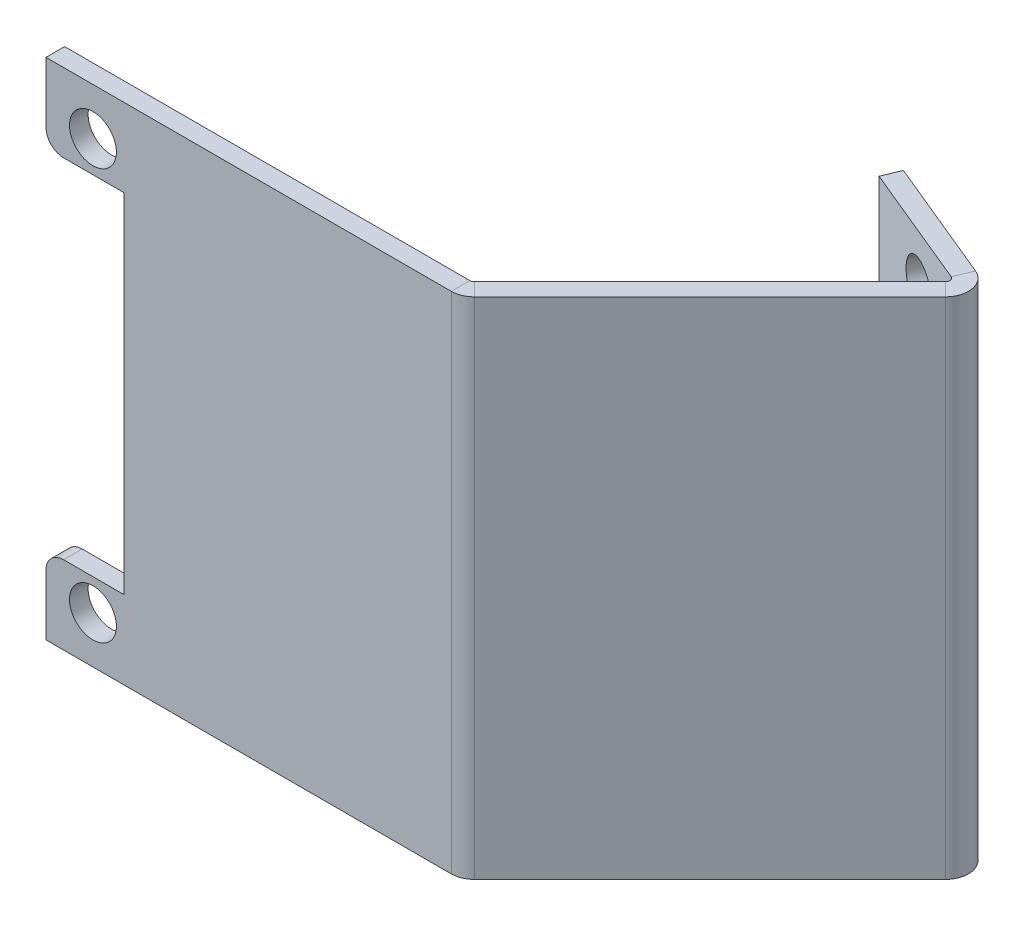
ISO-10303-21;
HEADER;
FILE_DESCRIPTION(('STEP AP214'),'2;1');
FILE_NAME('part.step','',(''),(''),'','','');
FILE_SCHEMA(('AUTOMOTIVE_DESIGN { 1 0 10303 214 1 1 1 1 }'));
ENDSEC;
DATA;
#1=APPLICATION_CONTEXT('core data for automotive mechanical design processes');
#2=APPLICATION_PROTOCOL_DEFINITION('international standard','automotive_design',2000,#1);
#3=PRODUCT_CONTEXT('',#1,'mechanical');
#4=PRODUCT('Part','Part','',(#3));
#5=PRODUCT_RELATED_PRODUCT_CATEGORY('part','',(#4));
#6=PRODUCT_DEFINITION_FORMATION('','',#4);
#7=PRODUCT_DEFINITION_CONTEXT('part definition',#1,'design');
#8=PRODUCT_DEFINITION('design','',#6,#7);
#9=PRODUCT_DEFINITION_SHAPE('','',#8);
#10=(LENGTH_UNIT() NAMED_UNIT(*) SI_UNIT(.MILLI.,.METRE.));
#11=(NAMED_UNIT(*) PLANE_ANGLE_UNIT() SI_UNIT($,.RADIAN.));
#12=(NAMED_UNIT(*) SI_UNIT($,.STERADIAN.) SOLID_ANGLE_UNIT());
#13=UNCERTAINTY_MEASURE_WITH_UNIT(LENGTH_MEASURE(1.E-05),#10,'distance_accuracy_value','');
#14=(GEOMETRIC_REPRESENTATION_CONTEXT(3) GLOBAL_UNCERTAINTY_ASSIGNED_CONTEXT((#13)) GLOBAL_UNIT_ASSIGNED_CONTEXT((#10,
#11,#12)) REPRESENTATION_CONTEXT('',''));
#15=CARTESIAN_POINT('',(0.,0.,0.));
#16=DIRECTION('',(0.,0.,1.));
#17=DIRECTION('',(1.,0.,0.));
#18=AXIS2_PLACEMENT_3D('',#15,#16,#17);
#19=CARTESIAN_POINT('',(-16.3657026940798,0.,-42.9267314711177));
#20=DIRECTION('',(-0.707106781186549,0.,-0.707106781186546));
#21=DIRECTION('',(-0.707106781186546,0.,0.707106781186549));
#22=AXIS2_PLACEMENT_3D('',#19,#20,#21);
#23=PLANE('',#22);
#24=DIRECTION('',(-0.707106781186546,0.,0.707106781186549));
#25=VECTOR('',#24,1.);
#26=CARTESIAN_POINT('',(1.31196683558388,86.,-60.6044010007815));
#27=LINE('',#26,#25);
#28=CARTESIAN_POINT('',(-17.9790939810444,86.,-41.3133401841531));
#29=VERTEX_POINT('',#28);
#30=CARTESIAN_POINT('',(-58.1467530504867,86.0000000000001,-1.1456811147107));
#31=VERTEX_POINT('',#30);
#32=EDGE_CURVE('E291',#29,#31,#27,.T.);
#33=ORIENTED_EDGE('',*,*,#32,.T.);
#34=DIRECTION('',(0.,-1.,0.));
#35=VECTOR('',#34,1.);
#36=CARTESIAN_POINT('',(-58.1467530504867,0.,-1.1456811147107));
#37=LINE('',#36,#35);
#38=CARTESIAN_POINT('',(-58.1467530504867,0.,-1.1456811147107));
#39=VERTEX_POINT('',#38);
#40=EDGE_CURVE('E348',#31,#39,#37,.T.);
#41=ORIENTED_EDGE('',*,*,#40,.T.);
#42=DIRECTION('',(-0.707106781186546,0.,0.707106781186549));
#43=VECTOR('',#42,1.);
#44=CARTESIAN_POINT('',(-16.3657026940798,0.,-42.9267314711177));
#45=LINE('',#44,#43);
#46=CARTESIAN_POINT('',(-17.9790939810444,0.,-41.3133401841531));
#47=VERTEX_POINT('',#46);
#48=EDGE_CURVE('E358',#47,#39,#45,.T.);
#49=ORIENTED_EDGE('',*,*,#48,.F.);
#50=DIRECTION('',(0.,-1.,0.));
#51=VECTOR('',#50,1.);
#52=CARTESIAN_POINT('',(-17.9790939810444,0.,-41.3133401841531));
#53=LINE('',#52,#51);
#54=EDGE_CURVE('E282',#29,#47,#53,.T.);
#55=ORIENTED_EDGE('',*,*,#54,.F.);
#56=EDGE_LOOP('',(#33,#41,#49,#55));
#57=FACE_BOUND('',#56,.T.);
#58=ADVANCED_FACE('F54',(#57),#23,.F.);
#59=CARTESIAN_POINT('',(-18.6107667243471,0.,-45.171795501385));
#60=DIRECTION('',(0.,1.,0.));
#61=DIRECTION('',(-0.707106781186546,0.,0.707106781186549));
#62=AXIS2_PLACEMENT_3D('',#59,#60,#61);
#63=PLANE('',#62);
#64=ORIENTED_EDGE('',*,*,#48,.T.);
#65=DIRECTION('',(-0.707106781186549,0.,-0.707106781186546));
#66=VECTOR('',#65,1.);
#67=CARTESIAN_POINT('',(-60.391817080754,0.,-3.39074514497799));
#68=LINE('',#67,#66);
#69=CARTESIAN_POINT('',(-60.391817080754,0.,-3.39074514497799));
#70=VERTEX_POINT('',#69);
#71=EDGE_CURVE('E346',#39,#70,#68,.T.);
#72=ORIENTED_EDGE('',*,*,#71,.T.);
#73=DIRECTION('',(-0.707106781186546,0.,0.707106781186549));
#74=VECTOR('',#73,1.);
#75=CARTESIAN_POINT('',(-0.933097194683407,0.,-62.8494650310487));
#76=LINE('',#75,#74);
#77=CARTESIAN_POINT('',(-20.2241580113117,0.,-43.5584042144204));
#78=VERTEX_POINT('',#77);
#79=EDGE_CURVE('E295',#78,#70,#76,.T.);
#80=ORIENTED_EDGE('',*,*,#79,.F.);
#81=DIRECTION('',(-0.707106781186549,0.,-0.707106781186546));
#82=VECTOR('',#81,1.);
#83=CARTESIAN_POINT('',(-20.2241580113117,0.,-43.5584042144204));
#84=LINE('',#83,#82);
#85=EDGE_CURVE('E296',#47,#78,#84,.T.);
#86=ORIENTED_EDGE('',*,*,#85,.F.);
#87=EDGE_LOOP('',(#64,#72,#80,#86));
#88=FACE_BOUND('',#87,.T.);
#89=ADVANCED_FACE('F415',(#88),#63,.F.);
#90=CARTESIAN_POINT('',(-18.3551309466514,0.,-43.8866276605751));
#91=DIRECTION('',(0.,1.,0.));
#92=DIRECTION('',(0.923879532511289,0.,0.382683432365084));
#93=AXIS2_PLACEMENT_3D('',#90,#91,#92);
#94=PLANE('',#93);
#95=DIRECTION('',(0.923879532511289,0.,0.382683432365084));
#96=VECTOR('',#95,1.);
#97=CARTESIAN_POINT('',(-17.1401110488922,0.,-46.8199451762984));
#98=LINE('',#97,#96);
#99=CARTESIAN_POINT('',(-40.2370993616744,0.,-56.3870309854255));
#100=VERTEX_POINT('',#99);
#101=CARTESIAN_POINT('',(-19.2481083522945,0.,-47.6931062488135));
#102=VERTEX_POINT('',#101);
#103=EDGE_CURVE('E321',#100,#102,#98,.T.);
#104=ORIENTED_EDGE('',*,*,#103,.T.);
#105=DIRECTION('',(-0.382683432365084,0.,0.923879532511289));
#106=VECTOR('',#105,1.);
#107=CARTESIAN_POINT('',(-20.4631282500536,0.,-44.7597887330902));
#108=LINE('',#107,#106);
#109=CARTESIAN_POINT('',(-20.4631282500536,0.,-44.7597887330902));
#110=VERTEX_POINT('',#109);
#111=EDGE_CURVE('E331',#102,#110,#108,.T.);
#112=ORIENTED_EDGE('',*,*,#111,.T.);
#113=DIRECTION('',(0.923879532511289,0.,0.382683432365084));
#114=VECTOR('',#113,1.);
#115=CARTESIAN_POINT('',(-41.4521192594336,0.,-53.4537134697022));
#116=LINE('',#115,#114);
#117=CARTESIAN_POINT('',(-41.4521192594336,0.,-53.4537134697022));
#118=VERTEX_POINT('',#117);
#119=EDGE_CURVE('E317',#118,#110,#116,.T.);
#120=ORIENTED_EDGE('',*,*,#119,.F.);
#121=DIRECTION('',(0.382683432365084,0.,-0.923879532511289));
#122=VECTOR('',#121,1.);
#123=CARTESIAN_POINT('',(-41.4521192594336,0.,-53.4537134697022));
#124=LINE('',#123,#122);
#125=EDGE_CURVE('E324',#118,#100,#124,.T.);
#126=ORIENTED_EDGE('',*,*,#125,.T.);
#127=EDGE_LOOP('',(#104,#112,#120,#126));
#128=FACE_BOUND('',#127,.T.);
#129=ADVANCED_FACE('F447',(#128),#94,.F.);
#130=CARTESIAN_POINT('',(-17.1401110488922,0.,-46.8199451762984));
#131=DIRECTION('',(-0.382683432365084,0.,0.923879532511289));
#132=DIRECTION('',(0.923879532511289,0.,0.382683432365084));
#133=AXIS2_PLACEMENT_3D('',#130,#131,#132);
#134=PLANE('',#133);
#135=CARTESIAN_POINT('',(-28.6886052052833,8.00000000000001,-51.603488080862));
#136=DIRECTION('',(0.382683432365084,0.,-0.923879532511289));
#137=DIRECTION('',(-0.923879532511289,0.,-0.382683432365084));
#138=AXIS2_PLACEMENT_3D('',#135,#136,#137);
#139=CIRCLE('',#138,4.);
#140=CARTESIAN_POINT('',(-32.3841233353285,8.00000000000001,-53.1342218103223));
#141=VERTEX_POINT('',#140);
#142=EDGE_CURVE('E304',#141,#141,#139,.T.);
#143=ORIENTED_EDGE('',*,*,#142,.F.);
#144=EDGE_LOOP('',(#143));
#145=FACE_BOUND('',#144,.T.);
#146=CARTESIAN_POINT('',(-28.6886052052833,78.,-51.603488080862));
#147=DIRECTION('',(0.382683432365084,0.,-0.923879532511289));
#148=DIRECTION('',(-0.923879532511289,0.,-0.382683432365084));
#149=AXIS2_PLACEMENT_3D('',#146,#147,#148);
#150=CIRCLE('',#149,4.);
#151=CARTESIAN_POINT('',(-32.3841233353285,78.,-53.1342218103223));
#152=VERTEX_POINT('',#151);
#153=EDGE_CURVE('E305',#152,#152,#150,.T.);
#154=ORIENTED_EDGE('',*,*,#153,.F.);
#155=EDGE_LOOP('',(#154));
#156=FACE_BOUND('',#155,.T.);
#157=DIRECTION('',(0.923879532511289,0.,0.382683432365084));
#158=VECTOR('',#157,1.);
#159=CARTESIAN_POINT('',(-40.2370993616744,86.,-56.3870309854255));
#160=LINE('',#159,#158);
#161=CARTESIAN_POINT('',(-40.2370993616744,86.,-56.3870309854255));
#162=VERTEX_POINT('',#161);
#163=CARTESIAN_POINT('',(-19.2481083522945,86.,-47.6931062488135));
#164=VERTEX_POINT('',#163);
#165=EDGE_CURVE('E318',#162,#164,#160,.T.);
#166=ORIENTED_EDGE('',*,*,#165,.T.);
#167=DIRECTION('',(0.,-1.,0.));
#168=VECTOR('',#167,1.);
#169=CARTESIAN_POINT('',(-19.2481083522945,0.,-47.6931062488135));
#170=LINE('',#169,#168);
#171=EDGE_CURVE('E333',#164,#102,#170,.T.);
#172=ORIENTED_EDGE('',*,*,#171,.T.);
#173=ORIENTED_EDGE('',*,*,#103,.F.);
#174=DIRECTION('',(0.,-1.,0.));
#175=VECTOR('',#174,1.);
#176=CARTESIAN_POINT('',(-40.2370993616744,86.,-56.3870309854255));
#177=LINE('',#176,#175);
#178=EDGE_CURVE('E311',#162,#100,#177,.T.);
#179=ORIENTED_EDGE('',*,*,#178,.F.);
#180=EDGE_LOOP('',(#166,#172,#173,#179));
#181=FACE_BOUND('',#180,.T.);
#182=ADVANCED_FACE('F444',(#145,#156,#181),#134,.F.);
#183=CARTESIAN_POINT('',(-18.3551309466514,0.,-43.8866276605751));
#184=DIRECTION('',(-0.382683432365084,0.,0.923879532511289));
#185=DIRECTION('',(0.923879532511289,0.,0.382683432365084));
#186=AXIS2_PLACEMENT_3D('',#183,#184,#185);
#187=PLANE('',#186);
#188=DIRECTION('',(0.,-1.,0.));
#189=VECTOR('',#188,1.);
#190=CARTESIAN_POINT('',(-20.4631282500536,0.,-44.7597887330902));
#191=LINE('',#190,#189);
#192=CARTESIAN_POINT('',(-20.4631282500536,86.,-44.7597887330902));
#193=VERTEX_POINT('',#192);
#194=EDGE_CURVE('E328',#193,#110,#191,.T.);
#195=ORIENTED_EDGE('',*,*,#194,.F.);
#196=DIRECTION('',(0.923879532511289,0.,0.382683432365084));
#197=VECTOR('',#196,1.);
#198=CARTESIAN_POINT('',(-18.3551309466514,86.,-43.8866276605751));
#199=LINE('',#198,#197);
#200=CARTESIAN_POINT('',(-41.4521192594336,86.,-53.4537134697022));
#201=VERTEX_POINT('',#200);
#202=EDGE_CURVE('E325',#201,#193,#199,.T.);
#203=ORIENTED_EDGE('',*,*,#202,.F.);
#204=DIRECTION('',(0.,-1.,0.));
#205=VECTOR('',#204,1.);
#206=CARTESIAN_POINT('',(-41.4521192594336,86.,-53.4537134697022));
#207=LINE('',#206,#205);
#208=EDGE_CURVE('E314',#201,#118,#207,.T.);
#209=ORIENTED_EDGE('',*,*,#208,.T.);
#210=ORIENTED_EDGE('',*,*,#119,.T.);
#211=EDGE_LOOP('',(#195,#203,#209,#210));
#212=FACE_BOUND('',#211,.T.);
#213=CARTESIAN_POINT('',(-29.9036251030425,78.,-48.6701705651386));
#214=DIRECTION('',(0.382683432365084,0.,-0.923879532511289));
#215=DIRECTION('',(-0.923879532511289,0.,-0.382683432365084));
#216=AXIS2_PLACEMENT_3D('',#213,#214,#215);
#217=CIRCLE('',#216,4.);
#218=CARTESIAN_POINT('',(-33.5991432330876,78.,-50.200904294599));
#219=VERTEX_POINT('',#218);
#220=EDGE_CURVE('E301',#219,#219,#217,.T.);
#221=ORIENTED_EDGE('',*,*,#220,.T.);
#222=EDGE_LOOP('',(#221));
#223=FACE_BOUND('',#222,.T.);
#224=CARTESIAN_POINT('',(-29.9036251030425,8.00000000000001,-48.6701705651386));
#225=DIRECTION('',(0.382683432365084,0.,-0.923879532511289));
#226=DIRECTION('',(-0.923879532511289,0.,-0.382683432365084));
#227=AXIS2_PLACEMENT_3D('',#224,#225,#226);
#228=CIRCLE('',#227,4.);
#229=CARTESIAN_POINT('',(-33.5991432330876,8.00000000000001,-50.200904294599));
#230=VERTEX_POINT('',#229);
#231=EDGE_CURVE('E308',#230,#230,#228,.T.);
#232=ORIENTED_EDGE('',*,*,#231,.T.);
#233=EDGE_LOOP('',(#232));
#234=FACE_BOUND('',#233,.T.);
#235=ADVANCED_FACE('F428',(#212,#223,#234),#187,.T.);
#236=CARTESIAN_POINT('',(-41.4521192594336,86.,-53.4537134697022));
#237=DIRECTION('',(0.923879532511289,0.,0.382683432365084));
#238=DIRECTION('',(0.382683432365084,0.,-0.923879532511289));
#239=AXIS2_PLACEMENT_3D('',#236,#237,#238);
#240=PLANE('',#239);
#241=ORIENTED_EDGE('',*,*,#178,.T.);
#242=ORIENTED_EDGE('',*,*,#125,.F.);
#243=ORIENTED_EDGE('',*,*,#208,.F.);
#244=DIRECTION('',(0.382683432365084,0.,-0.923879532511289));
#245=VECTOR('',#244,1.);
#246=CARTESIAN_POINT('',(-41.4521192594336,86.,-53.4537134697022));
#247=LINE('',#246,#245);
#248=EDGE_CURVE('E322',#201,#162,#247,.T.);
#249=ORIENTED_EDGE('',*,*,#248,.T.);
#250=EDGE_LOOP('',(#241,#242,#243,#249));
#251=FACE_BOUND('',#250,.T.);
#252=ADVANCED_FACE('F450',(#251),#240,.F.);
#253=CARTESIAN_POINT('',(-41.4521192594336,86.,-53.4537134697022));
#254=DIRECTION('',(0.,1.,0.));
#255=DIRECTION('',(0.923879532511289,0.,0.382683432365084));
#256=AXIS2_PLACEMENT_3D('',#253,#254,#255);
#257=PLANE('',#256);
#258=DIRECTION('',(-0.382683432365084,0.,0.923879532511289));
#259=VECTOR('',#258,1.);
#260=CARTESIAN_POINT('',(-20.4631282500536,86.,-44.7597887330902));
#261=LINE('',#260,#259);
#262=EDGE_CURVE('E336',#164,#193,#261,.T.);
#263=ORIENTED_EDGE('',*,*,#262,.F.);
#264=ORIENTED_EDGE('',*,*,#165,.F.);
#265=ORIENTED_EDGE('',*,*,#248,.F.);
#266=ORIENTED_EDGE('',*,*,#202,.T.);
#267=EDGE_LOOP('',(#263,#264,#265,#266));
#268=FACE_BOUND('',#267,.T.);
#269=ADVANCED_FACE('F433',(#268),#257,.T.);
#270=CARTESIAN_POINT('',(-29.9036251030425,8.00000000000001,-48.6701705651386));
#271=DIRECTION('',(0.382683432365084,0.,-0.923879532511289));
#272=DIRECTION('',(-0.923879532511289,0.,-0.382683432365084));
#273=AXIS2_PLACEMENT_3D('',#270,#271,#272);
#274=CYLINDRICAL_SURFACE('',#273,4.);
#275=ORIENTED_EDGE('',*,*,#231,.F.);
#276=EDGE_LOOP('',(#275));
#277=FACE_BOUND('',#276,.T.);
#278=ORIENTED_EDGE('',*,*,#142,.T.);
#279=EDGE_LOOP('',(#278));
#280=FACE_BOUND('',#279,.T.);
#281=ADVANCED_FACE('F457',(#277,#280),#274,.F.);
#282=CARTESIAN_POINT('',(-29.9036251030425,78.,-48.6701705651386));
#283=DIRECTION('',(0.382683432365084,0.,-0.923879532511289));
#284=DIRECTION('',(-0.923879532511289,0.,-0.382683432365084));
#285=AXIS2_PLACEMENT_3D('',#282,#283,#284);
#286=CYLINDRICAL_SURFACE('',#285,4.);
#287=ORIENTED_EDGE('',*,*,#220,.F.);
#288=EDGE_LOOP('',(#287));
#289=FACE_BOUND('',#288,.T.);
#290=ORIENTED_EDGE('',*,*,#153,.T.);
#291=EDGE_LOOP('',(#290));
#292=FACE_BOUND('',#291,.T.);
#293=ADVANCED_FACE('F524',(#289,#292),#286,.F.);
#294=CARTESIAN_POINT('',(-18.6107667243471,0.,-45.171795501385));
#295=DIRECTION('',(-0.707106781186549,0.,-0.707106781186546));
#296=DIRECTION('',(-0.707106781186546,0.,0.707106781186549));
#297=AXIS2_PLACEMENT_3D('',#294,#295,#296);
#298=PLANE('',#297);
#299=DIRECTION('',(0.,-1.,0.));
#300=VECTOR('',#299,1.);
#301=CARTESIAN_POINT('',(-60.391817080754,0.,-3.39074514497799));
#302=LINE('',#301,#300);
#303=CARTESIAN_POINT('',(-60.391817080754,86.,-3.39074514497799));
#304=VERTEX_POINT('',#303);
#305=EDGE_CURVE('E215',#304,#70,#302,.T.);
#306=ORIENTED_EDGE('',*,*,#305,.F.);
#307=DIRECTION('',(-0.707106781186546,0.,0.707106781186549));
#308=VECTOR('',#307,1.);
#309=CARTESIAN_POINT('',(-18.6107667243471,86.,-45.171795501385));
#310=LINE('',#309,#308);
#311=CARTESIAN_POINT('',(-20.2241580113117,86.,-43.5584042144204));
#312=VERTEX_POINT('',#311);
#313=EDGE_CURVE('E290',#312,#304,#310,.T.);
#314=ORIENTED_EDGE('',*,*,#313,.F.);
#315=DIRECTION('',(0.,-1.,0.));
#316=VECTOR('',#315,1.);
#317=CARTESIAN_POINT('',(-20.2241580113117,0.,-43.5584042144204));
#318=LINE('',#317,#316);
#319=EDGE_CURVE('E292',#312,#78,#318,.T.);
#320=ORIENTED_EDGE('',*,*,#319,.T.);
#321=ORIENTED_EDGE('',*,*,#79,.T.);
#322=EDGE_LOOP('',(#306,#314,#320,#321));
#323=FACE_BOUND('',#322,.T.);
#324=ADVANCED_FACE('F417',(#323),#298,.T.);
#325=CARTESIAN_POINT('',(-0.933097194683407,86.,-62.8494650310487));
#326=DIRECTION('',(0.,1.,0.));
#327=DIRECTION('',(-0.707106781186546,0.,0.707106781186549));
#328=AXIS2_PLACEMENT_3D('',#325,#326,#327);
#329=PLANE('',#328);
#330=DIRECTION('',(-0.707106781186549,0.,-0.707106781186546));
#331=VECTOR('',#330,1.);
#332=CARTESIAN_POINT('',(-60.391817080754,86.0000000000001,-3.39074514497799));
#333=LINE('',#332,#331);
#334=EDGE_CURVE('E351',#31,#304,#333,.T.);
#335=ORIENTED_EDGE('',*,*,#334,.F.);
#336=ORIENTED_EDGE('',*,*,#32,.F.);
#337=DIRECTION('',(-0.707106781186549,0.,-0.707106781186546));
#338=VECTOR('',#337,1.);
#339=CARTESIAN_POINT('',(-20.2241580113117,86.,-43.5584042144204));
#340=LINE('',#339,#338);
#341=EDGE_CURVE('E287',#29,#312,#340,.T.);
#342=ORIENTED_EDGE('',*,*,#341,.T.);
#343=ORIENTED_EDGE('',*,*,#313,.T.);
#344=EDGE_LOOP('',(#335,#336,#342,#343));
#345=FACE_BOUND('',#344,.T.);
#346=ADVANCED_FACE('F469',(#345),#329,.T.);
#347=CARTESIAN_POINT('',(-20.7450128663337,86.,-44.0792590694424));
#348=DIRECTION('',(0.,-1.,0.));
#349=DIRECTION('',(-0.707106781186549,0.,-0.707106781186546));
#350=AXIS2_PLACEMENT_3D('',#347,#348,#349);
#351=PLANE('',#350);
#352=ORIENTED_EDGE('',*,*,#341,.F.);
#353=CARTESIAN_POINT('',(-20.7450128663337,86.,-44.0792590694424));
#354=DIRECTION('',(0.,-1.,0.));
#355=DIRECTION('',(-0.707106781186549,0.,-0.707106781186546));
#356=AXIS2_PLACEMENT_3D('',#353,#354,#355);
#357=CIRCLE('',#356,3.9116);
#358=EDGE_CURVE('E228',#29,#164,#357,.F.);
#359=ORIENTED_EDGE('',*,*,#358,.T.);
#360=ORIENTED_EDGE('',*,*,#262,.T.);
#361=CARTESIAN_POINT('',(-20.7450128663337,86.,-44.0792590694424));
#362=DIRECTION('',(0.,1.,0.));
#363=DIRECTION('',(-0.707106781186549,0.,-0.707106781186546));
#364=AXIS2_PLACEMENT_3D('',#361,#362,#363);
#365=CIRCLE('',#364,0.7366);
#366=EDGE_CURVE('E275',#312,#193,#365,.T.);
#367=ORIENTED_EDGE('',*,*,#366,.F.);
#368=EDGE_LOOP('',(#352,#359,#360,#367));
#369=FACE_BOUND('',#368,.T.);
#370=ADVANCED_FACE('F439',(#369),#351,.F.);
#371=CARTESIAN_POINT('',(-20.7450128663337,0.,-44.0792590694424));
#372=DIRECTION('',(0.,1.,0.));
#373=DIRECTION('',(0.707106781186549,0.,0.707106781186546));
#374=AXIS2_PLACEMENT_3D('',#371,#372,#373);
#375=PLANE('',#374);
#376=CARTESIAN_POINT('',(-20.7450128663337,1.11022302462516E-13,-44.0792590694424));
#377=DIRECTION('',(0.,-1.,0.));
#378=DIRECTION('',(-0.707106781186549,0.,-0.707106781186546));
#379=AXIS2_PLACEMENT_3D('',#376,#377,#378);
#380=CIRCLE('',#379,3.9116);
#381=EDGE_CURVE('E279',#102,#47,#380,.T.);
#382=ORIENTED_EDGE('',*,*,#381,.T.);
#383=ORIENTED_EDGE('',*,*,#85,.T.);
#384=CARTESIAN_POINT('',(-20.7450128663337,0.,-44.0792590694424));
#385=DIRECTION('',(0.,-1.,0.));
#386=DIRECTION('',(-0.707106781186549,0.,-0.707106781186546));
#387=AXIS2_PLACEMENT_3D('',#384,#385,#386);
#388=CIRCLE('',#387,0.7366);
#389=EDGE_CURVE('E278',#110,#78,#388,.T.);
#390=ORIENTED_EDGE('',*,*,#389,.F.);
#391=ORIENTED_EDGE('',*,*,#111,.F.);
#392=EDGE_LOOP('',(#382,#383,#390,#391));
#393=FACE_BOUND('',#392,.T.);
#394=ADVANCED_FACE('F423',(#393),#375,.F.);
#395=CARTESIAN_POINT('',(-20.7450128663337,129.179492204113,-44.0792590694424));
#396=DIRECTION('',(0.,-1.,0.));
#397=DIRECTION('',(-0.707106781186549,0.,-0.707106781186546));
#398=AXIS2_PLACEMENT_3D('',#395,#396,#397);
#399=CYLINDRICAL_SURFACE('',#398,0.7366);
#400=ORIENTED_EDGE('',*,*,#194,.T.);
#401=ORIENTED_EDGE('',*,*,#389,.T.);
#402=ORIENTED_EDGE('',*,*,#319,.F.);
#403=ORIENTED_EDGE('',*,*,#366,.T.);
#404=EDGE_LOOP('',(#400,#401,#402,#403));
#405=FACE_BOUND('',#404,.T.);
#406=ADVANCED_FACE('F426',(#405),#399,.F.);
#407=CARTESIAN_POINT('',(-20.7450128663337,129.179492204113,-44.0792590694424));
#408=DIRECTION('',(0.,-1.,0.));
#409=DIRECTION('',(-0.707106781186549,0.,-0.707106781186546));
#410=AXIS2_PLACEMENT_3D('',#407,#408,#409);
#411=CYLINDRICAL_SURFACE('',#410,3.9116);
#412=ORIENTED_EDGE('',*,*,#171,.F.);
#413=ORIENTED_EDGE('',*,*,#358,.F.);
#414=ORIENTED_EDGE('',*,*,#54,.T.);
#415=ORIENTED_EDGE('',*,*,#381,.F.);
#416=EDGE_LOOP('',(#412,#413,#414,#415));
#417=FACE_BOUND('',#416,.T.);
#418=ADVANCED_FACE('F442',(#417),#411,.T.);
#419=CARTESIAN_POINT('',(-130.,72.666,-3.175));
#420=DIRECTION('',(1.,0.,0.));
#421=DIRECTION('',(0.,0.,-1.));
#422=AXIS2_PLACEMENT_3D('',#419,#420,#421);
#423=PLANE('',#422);
#424=DIRECTION('',(0.,1.,0.));
#425=VECTOR('',#424,1.);
#426=CARTESIAN_POINT('',(-130.,72.666,-3.175));
#427=LINE('',#426,#425);
#428=CARTESIAN_POINT('',(-130.,75.666,-3.175));
#429=VERTEX_POINT('',#428);
#430=CARTESIAN_POINT('',(-130.,86.,-3.175));
#431=VERTEX_POINT('',#430);
#432=EDGE_CURVE('E245',#429,#431,#427,.T.);
#433=ORIENTED_EDGE('',*,*,#432,.F.);
#434=DIRECTION('',(0.,0.,1.));
#435=VECTOR('',#434,1.);
#436=CARTESIAN_POINT('',(-130.,75.666,0.));
#437=LINE('',#436,#435);
#438=CARTESIAN_POINT('',(-130.,75.666,0.));
#439=VERTEX_POINT('',#438);
#440=EDGE_CURVE('E354',#429,#439,#437,.T.);
#441=ORIENTED_EDGE('',*,*,#440,.T.);
#442=DIRECTION('',(0.,1.,0.));
#443=VECTOR('',#442,1.);
#444=CARTESIAN_POINT('',(-130.,72.666,0.));
#445=LINE('',#444,#443);
#446=CARTESIAN_POINT('',(-130.,86.,0.));
#447=VERTEX_POINT('',#446);
#448=EDGE_CURVE('E210',#439,#447,#445,.T.);
#449=ORIENTED_EDGE('',*,*,#448,.T.);
#450=DIRECTION('',(0.,0.,1.));
#451=VECTOR('',#450,1.);
#452=CARTESIAN_POINT('',(-130.,86.,-3.175));
#453=LINE('',#452,#451);
#454=EDGE_CURVE('E225',#431,#447,#453,.T.);
#455=ORIENTED_EDGE('',*,*,#454,.F.);
#456=EDGE_LOOP('',(#433,#441,#449,#455));
#457=FACE_BOUND('',#456,.T.);
#458=ADVANCED_FACE('F398',(#457),#423,.F.);
#459=CARTESIAN_POINT('',(-130.,72.666,-3.175));
#460=DIRECTION('',(0.,-1.,0.));
#461=DIRECTION('',(0.,0.,-1.));
#462=AXIS2_PLACEMENT_3D('',#459,#460,#461);
#463=PLANE('',#462);
#464=DIRECTION('',(1.,0.,0.));
#465=VECTOR('',#464,1.);
#466=CARTESIAN_POINT('',(-130.,72.666,0.));
#467=LINE('',#466,#465);
#468=CARTESIAN_POINT('',(-127.,72.666,0.));
#469=VERTEX_POINT('',#468);
#470=CARTESIAN_POINT('',(-116.7,72.666,0.));
#471=VERTEX_POINT('',#470);
#472=EDGE_CURVE('E238',#469,#471,#467,.T.);
#473=ORIENTED_EDGE('',*,*,#472,.F.);
#474=DIRECTION('',(0.,0.,1.));
#475=VECTOR('',#474,1.);
#476=CARTESIAN_POINT('',(-127.,72.666,-3.175));
#477=LINE('',#476,#475);
#478=CARTESIAN_POINT('',(-127.,72.666,-3.175));
#479=VERTEX_POINT('',#478);
#480=EDGE_CURVE('E368',#469,#479,#477,.F.);
#481=ORIENTED_EDGE('',*,*,#480,.T.);
#482=DIRECTION('',(1.,0.,0.));
#483=VECTOR('',#482,1.);
#484=CARTESIAN_POINT('',(-130.,72.666,-3.175));
#485=LINE('',#484,#483);
#486=CARTESIAN_POINT('',(-116.7,72.666,-3.175));
#487=VERTEX_POINT('',#486);
#488=EDGE_CURVE('E272',#479,#487,#485,.T.);
#489=ORIENTED_EDGE('',*,*,#488,.T.);
#490=DIRECTION('',(0.,0.,1.));
#491=VECTOR('',#490,1.);
#492=CARTESIAN_POINT('',(-116.7,72.666,-3.175));
#493=LINE('',#492,#491);
#494=EDGE_CURVE('E269',#487,#471,#493,.T.);
#495=ORIENTED_EDGE('',*,*,#494,.T.);
#496=EDGE_LOOP('',(#473,#481,#489,#495));
#497=FACE_BOUND('',#496,.T.);
#498=ADVANCED_FACE('F490',(#497),#463,.T.);
#499=CARTESIAN_POINT('',(-116.7,72.666,-3.175));
#500=DIRECTION('',(-1.,0.,0.));
#501=DIRECTION('',(0.,0.,1.));
#502=AXIS2_PLACEMENT_3D('',#499,#500,#501);
#503=PLANE('',#502);
#504=DIRECTION('',(0.,-1.,0.));
#505=VECTOR('',#504,1.);
#506=CARTESIAN_POINT('',(-116.7,72.666,0.));
#507=LINE('',#506,#505);
#508=CARTESIAN_POINT('',(-116.7,13.334,0.));
#509=VERTEX_POINT('',#508);
#510=EDGE_CURVE('E235',#471,#509,#507,.T.);
#511=ORIENTED_EDGE('',*,*,#510,.F.);
#512=ORIENTED_EDGE('',*,*,#494,.F.);
#513=DIRECTION('',(0.,-1.,0.));
#514=VECTOR('',#513,1.);
#515=CARTESIAN_POINT('',(-116.7,72.666,-3.175));
#516=LINE('',#515,#514);
#517=CARTESIAN_POINT('',(-116.7,13.334,-3.175));
#518=VERTEX_POINT('',#517);
#519=EDGE_CURVE('E266',#487,#518,#516,.T.);
#520=ORIENTED_EDGE('',*,*,#519,.T.);
#521=DIRECTION('',(0.,0.,1.));
#522=VECTOR('',#521,1.);
#523=CARTESIAN_POINT('',(-116.7,13.334,-3.175));
#524=LINE('',#523,#522);
#525=EDGE_CURVE('E263',#518,#509,#524,.T.);
#526=ORIENTED_EDGE('',*,*,#525,.T.);
#527=EDGE_LOOP('',(#511,#512,#520,#526));
#528=FACE_BOUND('',#527,.T.);
#529=ADVANCED_FACE('F388',(#528),#503,.T.);
#530=CARTESIAN_POINT('',(-130.,13.334,-3.175));
#531=DIRECTION('',(0.,-1.,0.));
#532=DIRECTION('',(0.,0.,-1.));
#533=AXIS2_PLACEMENT_3D('',#530,#531,#532);
#534=PLANE('',#533);
#535=DIRECTION('',(1.,0.,0.));
#536=VECTOR('',#535,1.);
#537=CARTESIAN_POINT('',(-130.,13.334,-3.175));
#538=LINE('',#537,#536);
#539=CARTESIAN_POINT('',(-127.,13.334,-3.175));
#540=VERTEX_POINT('',#539);
#541=EDGE_CURVE('E247',#540,#518,#538,.T.);
#542=ORIENTED_EDGE('',*,*,#541,.F.);
#543=DIRECTION('',(0.,0.,1.));
#544=VECTOR('',#543,1.);
#545=CARTESIAN_POINT('',(-127.,13.334,-3.175));
#546=LINE('',#545,#544);
#547=CARTESIAN_POINT('',(-127.,13.334,0.));
#548=VERTEX_POINT('',#547);
#549=EDGE_CURVE('E62',#540,#548,#546,.T.);
#550=ORIENTED_EDGE('',*,*,#549,.T.);
#551=DIRECTION('',(1.,0.,0.));
#552=VECTOR('',#551,1.);
#553=CARTESIAN_POINT('',(-130.,13.334,0.));
#554=LINE('',#553,#552);
#555=EDGE_CURVE('E261',#548,#509,#554,.T.);
#556=ORIENTED_EDGE('',*,*,#555,.T.);
#557=ORIENTED_EDGE('',*,*,#525,.F.);
#558=EDGE_LOOP('',(#542,#550,#556,#557));
#559=FACE_BOUND('',#558,.T.);
#560=ADVANCED_FACE('F376',(#559),#534,.F.);
#561=CARTESIAN_POINT('',(-130.,0.,-3.175));
#562=DIRECTION('',(1.,0.,0.));
#563=DIRECTION('',(0.,0.,-1.));
#564=AXIS2_PLACEMENT_3D('',#561,#562,#563);
#565=PLANE('',#564);
#566=DIRECTION('',(0.,1.,0.));
#567=VECTOR('',#566,1.);
#568=CARTESIAN_POINT('',(-130.,0.,0.));
#569=LINE('',#568,#567);
#570=CARTESIAN_POINT('',(-130.,0.,0.));
#571=VERTEX_POINT('',#570);
#572=CARTESIAN_POINT('',(-130.,10.334,0.));
#573=VERTEX_POINT('',#572);
#574=EDGE_CURVE('E259',#571,#573,#569,.T.);
#575=ORIENTED_EDGE('',*,*,#574,.T.);
#576=DIRECTION('',(0.,0.,1.));
#577=VECTOR('',#576,1.);
#578=CARTESIAN_POINT('',(-130.,10.334,-3.175));
#579=LINE('',#578,#577);
#580=CARTESIAN_POINT('',(-130.,10.334,-3.175));
#581=VERTEX_POINT('',#580);
#582=EDGE_CURVE('E12',#573,#581,#579,.F.);
#583=ORIENTED_EDGE('',*,*,#582,.T.);
#584=DIRECTION('',(0.,1.,0.));
#585=VECTOR('',#584,1.);
#586=CARTESIAN_POINT('',(-130.,0.,-3.175));
#587=LINE('',#586,#585);
#588=CARTESIAN_POINT('',(-130.,0.,-3.175));
#589=VERTEX_POINT('',#588);
#590=EDGE_CURVE('E187',#589,#581,#587,.T.);
#591=ORIENTED_EDGE('',*,*,#590,.F.);
#592=DIRECTION('',(0.,0.,1.));
#593=VECTOR('',#592,1.);
#594=CARTESIAN_POINT('',(-130.,0.,-3.175));
#595=LINE('',#594,#593);
#596=EDGE_CURVE('E186',#589,#571,#595,.T.);
#597=ORIENTED_EDGE('',*,*,#596,.T.);
#598=EDGE_LOOP('',(#575,#583,#591,#597));
#599=FACE_BOUND('',#598,.T.);
#600=ADVANCED_FACE('F497',(#599),#565,.F.);
#601=CARTESIAN_POINT('',(-122.,78.,-3.175));
#602=DIRECTION('',(0.,0.,1.));
#603=DIRECTION('',(1.,0.,0.));
#604=AXIS2_PLACEMENT_3D('',#601,#602,#603);
#605=CYLINDRICAL_SURFACE('',#604,4.00000000000001);
#606=CARTESIAN_POINT('',(-122.,78.,-3.175));
#607=DIRECTION('',(0.,0.,1.));
#608=DIRECTION('',(1.,0.,0.));
#609=AXIS2_PLACEMENT_3D('',#606,#607,#608);
#610=CIRCLE('',#609,4.00000000000001);
#611=CARTESIAN_POINT('',(-118.,78.,-3.175));
#612=VERTEX_POINT('',#611);
#613=EDGE_CURVE('E200',#612,#612,#610,.T.);
#614=ORIENTED_EDGE('',*,*,#613,.F.);
#615=EDGE_LOOP('',(#614));
#616=FACE_BOUND('',#615,.T.);
#617=CARTESIAN_POINT('',(-122.,78.,0.));
#618=DIRECTION('',(0.,0.,1.));
#619=DIRECTION('',(1.,0.,0.));
#620=AXIS2_PLACEMENT_3D('',#617,#618,#619);
#621=CIRCLE('',#620,4.00000000000001);
#622=CARTESIAN_POINT('',(-118.,78.,0.));
#623=VERTEX_POINT('',#622);
#624=EDGE_CURVE('E255',#623,#623,#621,.T.);
#625=ORIENTED_EDGE('',*,*,#624,.T.);
#626=EDGE_LOOP('',(#625));
#627=FACE_BOUND('',#626,.T.);
#628=ADVANCED_FACE('F500',(#616,#627),#605,.F.);
#629=CARTESIAN_POINT('',(-122.,8.00000000000001,-3.175));
#630=DIRECTION('',(0.,0.,1.));
#631=DIRECTION('',(1.,0.,0.));
#632=AXIS2_PLACEMENT_3D('',#629,#630,#631);
#633=CYLINDRICAL_SURFACE('',#632,4.00000000000001);
#634=CARTESIAN_POINT('',(-122.,8.00000000000001,-3.175));
#635=DIRECTION('',(0.,0.,-1.));
#636=DIRECTION('',(-1.,0.,0.));
#637=AXIS2_PLACEMENT_3D('',#634,#635,#636);
#638=CIRCLE('',#637,4.00000000000001);
#639=CARTESIAN_POINT('',(-126.,8.00000000000001,-3.175));
#640=VERTEX_POINT('',#639);
#641=EDGE_CURVE('E252',#640,#640,#638,.T.);
#642=ORIENTED_EDGE('',*,*,#641,.T.);
#643=EDGE_LOOP('',(#642));
#644=FACE_BOUND('',#643,.T.);
#645=CARTESIAN_POINT('',(-122.,8.00000000000001,0.));
#646=DIRECTION('',(0.,0.,-1.));
#647=DIRECTION('',(-1.,0.,0.));
#648=AXIS2_PLACEMENT_3D('',#645,#646,#647);
#649=CIRCLE('',#648,4.00000000000001);
#650=CARTESIAN_POINT('',(-126.,8.00000000000001,0.));
#651=VERTEX_POINT('',#650);
#652=EDGE_CURVE('E232',#651,#651,#649,.T.);
#653=ORIENTED_EDGE('',*,*,#652,.F.);
#654=EDGE_LOOP('',(#653));
#655=FACE_BOUND('',#654,.T.);
#656=ADVANCED_FACE('F503',(#644,#655),#633,.F.);
#657=CARTESIAN_POINT('',(0.,0.,-3.175));
#658=DIRECTION('',(0.,0.,-1.));
#659=DIRECTION('',(-1.,0.,0.));
#660=AXIS2_PLACEMENT_3D('',#657,#658,#659);
#661=PLANE('',#660);
#662=ORIENTED_EDGE('',*,*,#641,.F.);
#663=EDGE_LOOP('',(#662));
#664=FACE_BOUND('',#663,.T.);
#665=ORIENTED_EDGE('',*,*,#613,.T.);
#666=EDGE_LOOP('',(#665));
#667=FACE_BOUND('',#666,.T.);
#668=ORIENTED_EDGE('',*,*,#488,.F.);
#669=CARTESIAN_POINT('',(-127.,75.666,-3.175));
#670=DIRECTION('',(0.,0.,-1.));
#671=DIRECTION('',(-1.,0.,0.));
#672=AXIS2_PLACEMENT_3D('',#669,#670,#671);
#673=CIRCLE('',#672,3.);
#674=EDGE_CURVE('E371',#479,#429,#673,.T.);
#675=ORIENTED_EDGE('',*,*,#674,.T.);
#676=ORIENTED_EDGE('',*,*,#432,.T.);
#677=DIRECTION('',(-1.,0.,0.));
#678=VECTOR('',#677,1.);
#679=CARTESIAN_POINT('',(0.,86.,-3.175));
#680=LINE('',#679,#678);
#681=CARTESIAN_POINT('',(-60.912671935776,86.,-3.175));
#682=VERTEX_POINT('',#681);
#683=EDGE_CURVE('E194',#682,#431,#680,.T.);
#684=ORIENTED_EDGE('',*,*,#683,.F.);
#685=DIRECTION('',(0.,-1.,0.));
#686=VECTOR('',#685,1.);
#687=CARTESIAN_POINT('',(-60.912671935776,0.,-3.175));
#688=LINE('',#687,#686);
#689=CARTESIAN_POINT('',(-60.912671935776,0.,-3.175));
#690=VERTEX_POINT('',#689);
#691=EDGE_CURVE('E188',#682,#690,#688,.T.);
#692=ORIENTED_EDGE('',*,*,#691,.T.);
#693=DIRECTION('',(-1.,0.,0.));
#694=VECTOR('',#693,1.);
#695=CARTESIAN_POINT('',(25.,0.,-3.175));
#696=LINE('',#695,#694);
#697=EDGE_CURVE('E179',#690,#589,#696,.T.);
#698=ORIENTED_EDGE('',*,*,#697,.T.);
#699=ORIENTED_EDGE('',*,*,#590,.T.);
#700=CARTESIAN_POINT('',(-127.,10.334,-3.175));
#701=DIRECTION('',(0.,0.,-1.));
#702=DIRECTION('',(-1.,0.,0.));
#703=AXIS2_PLACEMENT_3D('',#700,#701,#702);
#704=CIRCLE('',#703,3.);
#705=EDGE_CURVE('E69',#581,#540,#704,.T.);
#706=ORIENTED_EDGE('',*,*,#705,.T.);
#707=ORIENTED_EDGE('',*,*,#541,.T.);
#708=ORIENTED_EDGE('',*,*,#519,.F.);
#709=EDGE_LOOP('',(#668,#675,#676,#684,#692,#698,#699,#706,#707,#708));
#710=FACE_BOUND('',#709,.T.);
#711=ADVANCED_FACE('F192',(#664,#667,#710),#661,.T.);
#712=CARTESIAN_POINT('',(0.,0.,-3.175));
#713=DIRECTION('',(0.,1.,0.));
#714=DIRECTION('',(-1.,0.,0.));
#715=AXIS2_PLACEMENT_3D('',#712,#713,#714);
#716=PLANE('',#715);
#717=DIRECTION('',(0.,0.,-1.));
#718=VECTOR('',#717,1.);
#719=CARTESIAN_POINT('',(-60.912671935776,0.,-3.175));
#720=LINE('',#719,#718);
#721=CARTESIAN_POINT('',(-60.912671935776,0.,0.));
#722=VERTEX_POINT('',#721);
#723=EDGE_CURVE('E183',#722,#690,#720,.T.);
#724=ORIENTED_EDGE('',*,*,#723,.F.);
#725=DIRECTION('',(-1.,0.,0.));
#726=VECTOR('',#725,1.);
#727=CARTESIAN_POINT('',(0.,0.,0.));
#728=LINE('',#727,#726);
#729=EDGE_CURVE('E243',#722,#571,#728,.T.);
#730=ORIENTED_EDGE('',*,*,#729,.T.);
#731=ORIENTED_EDGE('',*,*,#596,.F.);
#732=ORIENTED_EDGE('',*,*,#697,.F.);
#733=EDGE_LOOP('',(#724,#730,#731,#732));
#734=FACE_BOUND('',#733,.T.);
#735=ADVANCED_FACE('F181',(#734),#716,.F.);
#736=CARTESIAN_POINT('',(0.,0.,0.));
#737=DIRECTION('',(0.,0.,-1.));
#738=DIRECTION('',(-1.,0.,0.));
#739=AXIS2_PLACEMENT_3D('',#736,#737,#738);
#740=PLANE('',#739);
#741=ORIENTED_EDGE('',*,*,#448,.F.);
#742=CARTESIAN_POINT('',(-127.,75.666,0.));
#743=DIRECTION('',(0.,0.,-1.));
#744=DIRECTION('',(-1.,0.,0.));
#745=AXIS2_PLACEMENT_3D('',#742,#743,#744);
#746=CIRCLE('',#745,3.);
#747=EDGE_CURVE('E366',#439,#469,#746,.F.);
#748=ORIENTED_EDGE('',*,*,#747,.T.);
#749=ORIENTED_EDGE('',*,*,#472,.T.);
#750=ORIENTED_EDGE('',*,*,#510,.T.);
#751=ORIENTED_EDGE('',*,*,#555,.F.);
#752=CARTESIAN_POINT('',(-127.,10.334,0.));
#753=DIRECTION('',(0.,0.,-1.));
#754=DIRECTION('',(-1.,0.,0.));
#755=AXIS2_PLACEMENT_3D('',#752,#753,#754);
#756=CIRCLE('',#755,3.);
#757=EDGE_CURVE('E364',#548,#573,#756,.F.);
#758=ORIENTED_EDGE('',*,*,#757,.T.);
#759=ORIENTED_EDGE('',*,*,#574,.F.);
#760=ORIENTED_EDGE('',*,*,#729,.F.);
#761=DIRECTION('',(0.,-1.,0.));
#762=VECTOR('',#761,1.);
#763=CARTESIAN_POINT('',(-60.912671935776,0.,0.));
#764=LINE('',#763,#762);
#765=CARTESIAN_POINT('',(-60.912671935776,86.0000000000001,0.));
#766=VERTEX_POINT('',#765);
#767=EDGE_CURVE('E211',#766,#722,#764,.T.);
#768=ORIENTED_EDGE('',*,*,#767,.F.);
#769=DIRECTION('',(-1.,0.,0.));
#770=VECTOR('',#769,1.);
#771=CARTESIAN_POINT('',(25.,86.,0.));
#772=LINE('',#771,#770);
#773=EDGE_CURVE('E240',#766,#447,#772,.T.);
#774=ORIENTED_EDGE('',*,*,#773,.T.);
#775=EDGE_LOOP('',(#741,#748,#749,#750,#751,#758,#759,#760,#768,#774));
#776=FACE_BOUND('',#775,.T.);
#777=ORIENTED_EDGE('',*,*,#624,.F.);
#778=EDGE_LOOP('',(#777));
#779=FACE_BOUND('',#778,.T.);
#780=ORIENTED_EDGE('',*,*,#652,.T.);
#781=EDGE_LOOP('',(#780));
#782=FACE_BOUND('',#781,.T.);
#783=ADVANCED_FACE('F381',(#776,#779,#782),#740,.F.);
#784=CARTESIAN_POINT('',(25.,86.,-3.175));
#785=DIRECTION('',(0.,1.,0.));
#786=DIRECTION('',(-1.,0.,0.));
#787=AXIS2_PLACEMENT_3D('',#784,#785,#786);
#788=PLANE('',#787);
#789=ORIENTED_EDGE('',*,*,#773,.F.);
#790=DIRECTION('',(0.,0.,-1.));
#791=VECTOR('',#790,1.);
#792=CARTESIAN_POINT('',(-60.912671935776,86.0000000000001,-3.175));
#793=LINE('',#792,#791);
#794=EDGE_CURVE('E230',#766,#682,#793,.T.);
#795=ORIENTED_EDGE('',*,*,#794,.T.);
#796=ORIENTED_EDGE('',*,*,#683,.T.);
#797=ORIENTED_EDGE('',*,*,#454,.T.);
#798=EDGE_LOOP('',(#789,#795,#796,#797));
#799=FACE_BOUND('',#798,.T.);
#800=ADVANCED_FACE('F403',(#799),#788,.T.);
#801=CARTESIAN_POINT('',(-60.912671935776,86.,-3.9116));
#802=DIRECTION('',(0.,-1.,0.));
#803=DIRECTION('',(0.,0.,-1.));
#804=AXIS2_PLACEMENT_3D('',#801,#802,#803);
#805=PLANE('',#804);
#806=ORIENTED_EDGE('',*,*,#794,.F.);
#807=CARTESIAN_POINT('',(-60.912671935776,86.,-3.9116));
#808=DIRECTION('',(0.,-1.,0.));
#809=DIRECTION('',(0.,0.,-1.));
#810=AXIS2_PLACEMENT_3D('',#807,#808,#809);
#811=CIRCLE('',#810,3.9116);
#812=EDGE_CURVE('E221',#766,#31,#811,.F.);
#813=ORIENTED_EDGE('',*,*,#812,.T.);
#814=ORIENTED_EDGE('',*,*,#334,.T.);
#815=CARTESIAN_POINT('',(-60.912671935776,86.,-3.9116));
#816=DIRECTION('',(0.,1.,0.));
#817=DIRECTION('',(0.,0.,-1.));
#818=AXIS2_PLACEMENT_3D('',#815,#816,#817);
#819=CIRCLE('',#818,0.7366);
#820=EDGE_CURVE('E216',#682,#304,#819,.T.);
#821=ORIENTED_EDGE('',*,*,#820,.F.);
#822=EDGE_LOOP('',(#806,#813,#814,#821));
#823=FACE_BOUND('',#822,.T.);
#824=ADVANCED_FACE('F406',(#823),#805,.F.);
#825=CARTESIAN_POINT('',(-60.912671935776,0.,-3.9116));
#826=DIRECTION('',(0.,1.,0.));
#827=DIRECTION('',(0.,0.,1.));
#828=AXIS2_PLACEMENT_3D('',#825,#826,#827);
#829=PLANE('',#828);
#830=CARTESIAN_POINT('',(-60.912671935776,0.,-3.9116));
#831=DIRECTION('',(0.,-1.,0.));
#832=DIRECTION('',(0.,0.,-1.));
#833=AXIS2_PLACEMENT_3D('',#830,#831,#832);
#834=CIRCLE('',#833,3.9116);
#835=EDGE_CURVE('E209',#39,#722,#834,.T.);
#836=ORIENTED_EDGE('',*,*,#835,.T.);
#837=ORIENTED_EDGE('',*,*,#723,.T.);
#838=CARTESIAN_POINT('',(-60.912671935776,0.,-3.9116));
#839=DIRECTION('',(0.,-1.,0.));
#840=DIRECTION('',(0.,0.,-1.));
#841=AXIS2_PLACEMENT_3D('',#838,#839,#840);
#842=CIRCLE('',#841,0.7366);
#843=EDGE_CURVE('E207',#70,#690,#842,.T.);
#844=ORIENTED_EDGE('',*,*,#843,.F.);
#845=ORIENTED_EDGE('',*,*,#71,.F.);
#846=EDGE_LOOP('',(#836,#837,#844,#845));
#847=FACE_BOUND('',#846,.T.);
#848=ADVANCED_FACE('F205',(#847),#829,.F.);
#849=CARTESIAN_POINT('',(-60.912671935776,129.077944360036,-3.9116));
#850=DIRECTION('',(0.,-1.,0.));
#851=DIRECTION('',(0.,0.,-1.));
#852=AXIS2_PLACEMENT_3D('',#849,#850,#851);
#853=CYLINDRICAL_SURFACE('',#852,0.7366);
#854=ORIENTED_EDGE('',*,*,#305,.T.);
#855=ORIENTED_EDGE('',*,*,#843,.T.);
#856=ORIENTED_EDGE('',*,*,#691,.F.);
#857=ORIENTED_EDGE('',*,*,#820,.T.);
#858=EDGE_LOOP('',(#854,#855,#856,#857));
#859=FACE_BOUND('',#858,.T.);
#860=ADVANCED_FACE('F214',(#859),#853,.F.);
#861=CARTESIAN_POINT('',(-60.912671935776,129.077944360036,-3.9116));
#862=DIRECTION('',(0.,-1.,0.));
#863=DIRECTION('',(0.,0.,-1.));
#864=AXIS2_PLACEMENT_3D('',#861,#862,#863);
#865=CYLINDRICAL_SURFACE('',#864,3.9116);
#866=ORIENTED_EDGE('',*,*,#40,.F.);
#867=ORIENTED_EDGE('',*,*,#812,.F.);
#868=ORIENTED_EDGE('',*,*,#767,.T.);
#869=ORIENTED_EDGE('',*,*,#835,.F.);
#870=EDGE_LOOP('',(#866,#867,#868,#869));
#871=FACE_BOUND('',#870,.T.);
#872=ADVANCED_FACE('F409',(#871),#865,.T.);
#873=CARTESIAN_POINT('',(-127.,75.666,-3.175));
#874=DIRECTION('',(0.,0.,-1.));
#875=DIRECTION('',(-1.,0.,0.));
#876=AXIS2_PLACEMENT_3D('',#873,#874,#875);
#877=CYLINDRICAL_SURFACE('',#876,3.);
#878=ORIENTED_EDGE('',*,*,#674,.F.);
#879=ORIENTED_EDGE('',*,*,#480,.F.);
#880=ORIENTED_EDGE('',*,*,#747,.F.);
#881=ORIENTED_EDGE('',*,*,#440,.F.);
#882=EDGE_LOOP('',(#878,#879,#880,#881));
#883=FACE_BOUND('',#882,.T.);
#884=ADVANCED_FACE('F396',(#883),#877,.T.);
#885=CARTESIAN_POINT('',(-127.,10.334,-3.175));
#886=DIRECTION('',(0.,0.,1.));
#887=DIRECTION('',(1.,0.,0.));
#888=AXIS2_PLACEMENT_3D('',#885,#886,#887);
#889=CYLINDRICAL_SURFACE('',#888,3.);
#890=ORIENTED_EDGE('',*,*,#705,.F.);
#891=ORIENTED_EDGE('',*,*,#582,.F.);
#892=ORIENTED_EDGE('',*,*,#757,.F.);
#893=ORIENTED_EDGE('',*,*,#549,.F.);
#894=EDGE_LOOP('',(#890,#891,#892,#893));
#895=FACE_BOUND('',#894,.T.);
#896=ADVANCED_FACE('F56',(#895),#889,.T.);
#897=CLOSED_SHELL('',(#58,#89,#129,#182,#235,#252,#269,#281,#293,#324,#346,#370,#394,#406,#418,
#458,#498,#529,#560,#600,#628,#656,#711,#735,#783,#800,#824,#848,#860,#872,#884,#896));
#898=MANIFOLD_SOLID_BREP('B2',#897);
#899=ADVANCED_BREP_SHAPE_REPRESENTATION('',(#18,#898),#14);
#900=SHAPE_DEFINITION_REPRESENTATION(#9,#899);
ENDSEC;
END-ISO-10303-21;
